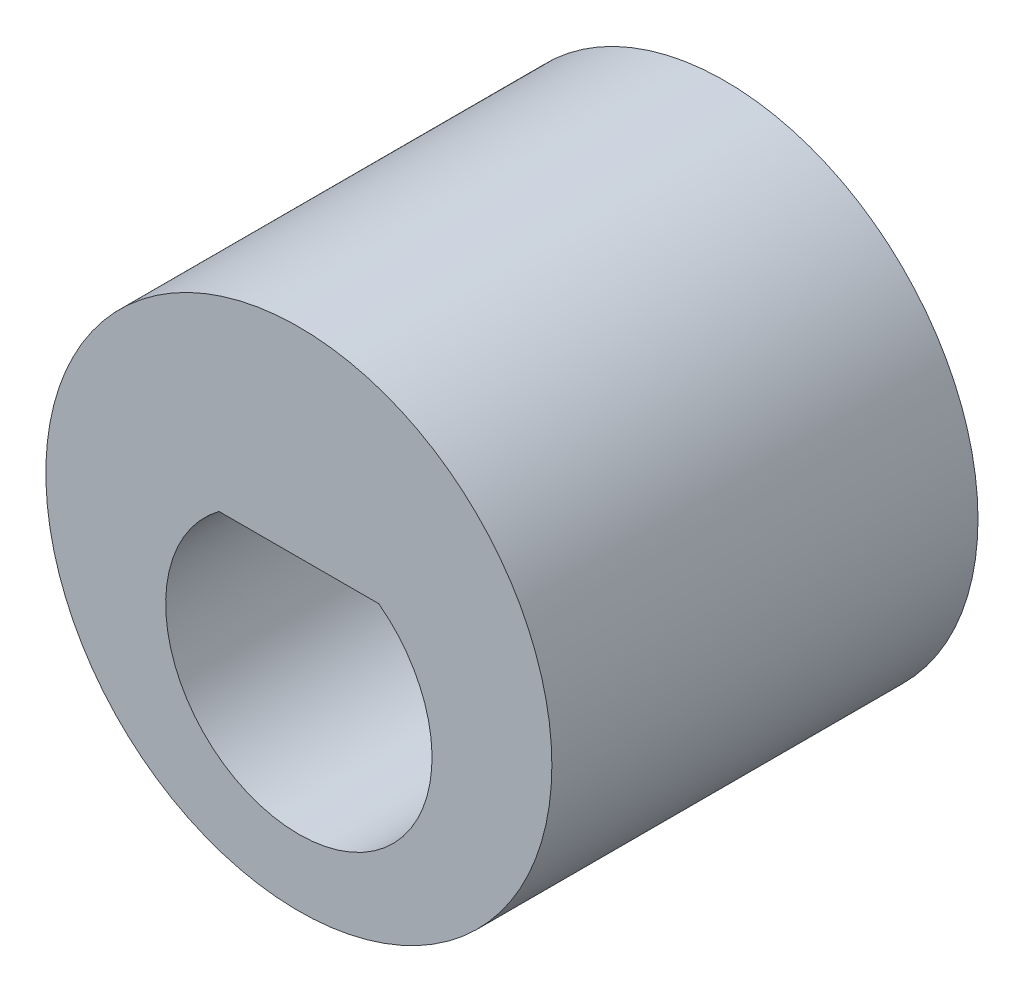
ISO-10303-21;
HEADER;
FILE_DESCRIPTION(('STEP AP214'),'2;1');
FILE_NAME('part.step','',(''),(''),'','','');
FILE_SCHEMA(('AUTOMOTIVE_DESIGN { 1 0 10303 214 1 1 1 1 }'));
ENDSEC;
DATA;
#1=APPLICATION_CONTEXT('core data for automotive mechanical design processes');
#2=APPLICATION_PROTOCOL_DEFINITION('international standard','automotive_design',2000,#1);
#3=PRODUCT_CONTEXT('',#1,'mechanical');
#4=PRODUCT('Part','Part','',(#3));
#5=PRODUCT_RELATED_PRODUCT_CATEGORY('part','',(#4));
#6=PRODUCT_DEFINITION_FORMATION('','',#4);
#7=PRODUCT_DEFINITION_CONTEXT('part definition',#1,'design');
#8=PRODUCT_DEFINITION('design','',#6,#7);
#9=PRODUCT_DEFINITION_SHAPE('','',#8);
#10=(LENGTH_UNIT() NAMED_UNIT(*) SI_UNIT(.MILLI.,.METRE.));
#11=(NAMED_UNIT(*) PLANE_ANGLE_UNIT() SI_UNIT($,.RADIAN.));
#12=(NAMED_UNIT(*) SI_UNIT($,.STERADIAN.) SOLID_ANGLE_UNIT());
#13=UNCERTAINTY_MEASURE_WITH_UNIT(LENGTH_MEASURE(1.E-05),#10,'distance_accuracy_value','');
#14=(GEOMETRIC_REPRESENTATION_CONTEXT(3) GLOBAL_UNCERTAINTY_ASSIGNED_CONTEXT((#13)) GLOBAL_UNIT_ASSIGNED_CONTEXT((#10,
#11,#12)) REPRESENTATION_CONTEXT('',''));
#15=CARTESIAN_POINT('',(0.,0.,0.));
#16=DIRECTION('',(0.,0.,1.));
#17=DIRECTION('',(1.,0.,0.));
#18=AXIS2_PLACEMENT_3D('',#15,#16,#17);
#19=CARTESIAN_POINT('',(0.,0.,8.));
#20=DIRECTION('',(0.,0.,-1.));
#21=DIRECTION('',(-1.,0.,0.));
#22=AXIS2_PLACEMENT_3D('',#19,#20,#21);
#23=CYLINDRICAL_SURFACE('',#22,2.5);
#24=CARTESIAN_POINT('',(0.,0.,0.));
#25=DIRECTION('',(0.,0.,1.));
#26=DIRECTION('',(1.,0.,0.));
#27=AXIS2_PLACEMENT_3D('',#24,#25,#26);
#28=CIRCLE('',#27,2.5);
#29=CARTESIAN_POINT('',(-1.5,2.,0.));
#30=VERTEX_POINT('',#29);
#31=CARTESIAN_POINT('',(1.5,2.,0.));
#32=VERTEX_POINT('',#31);
#33=EDGE_CURVE('E65',#30,#32,#28,.T.);
#34=ORIENTED_EDGE('',*,*,#33,.F.);
#35=DIRECTION('',(0.,0.,-1.));
#36=VECTOR('',#35,1.);
#37=CARTESIAN_POINT('',(-1.5,2.,8.));
#38=LINE('',#37,#36);
#39=CARTESIAN_POINT('',(-1.5,2.,8.));
#40=VERTEX_POINT('',#39);
#41=EDGE_CURVE('E11',#40,#30,#38,.T.);
#42=ORIENTED_EDGE('',*,*,#41,.F.);
#43=CARTESIAN_POINT('',(0.,0.,8.));
#44=DIRECTION('',(0.,0.,1.));
#45=DIRECTION('',(1.,0.,0.));
#46=AXIS2_PLACEMENT_3D('',#43,#44,#45);
#47=CIRCLE('',#46,2.5);
#48=CARTESIAN_POINT('',(1.5,2.,8.));
#49=VERTEX_POINT('',#48);
#50=EDGE_CURVE('E66',#40,#49,#47,.T.);
#51=ORIENTED_EDGE('',*,*,#50,.T.);
#52=DIRECTION('',(0.,0.,-1.));
#53=VECTOR('',#52,1.);
#54=CARTESIAN_POINT('',(1.5,2.,8.));
#55=LINE('',#54,#53);
#56=EDGE_CURVE('E45',#49,#32,#55,.T.);
#57=ORIENTED_EDGE('',*,*,#56,.T.);
#58=EDGE_LOOP('',(#34,#42,#51,#57));
#59=FACE_BOUND('',#58,.T.);
#60=ADVANCED_FACE('F37',(#59),#23,.F.);
#61=CARTESIAN_POINT('',(0.,2.,8.));
#62=DIRECTION('',(0.,1.,0.));
#63=DIRECTION('',(0.,0.,1.));
#64=AXIS2_PLACEMENT_3D('',#61,#62,#63);
#65=PLANE('',#64);
#66=DIRECTION('',(1.,0.,0.));
#67=VECTOR('',#66,1.);
#68=CARTESIAN_POINT('',(0.,2.,0.));
#69=LINE('',#68,#67);
#70=EDGE_CURVE('E68',#30,#32,#69,.T.);
#71=ORIENTED_EDGE('',*,*,#70,.T.);
#72=ORIENTED_EDGE('',*,*,#56,.F.);
#73=DIRECTION('',(1.,0.,0.));
#74=VECTOR('',#73,1.);
#75=CARTESIAN_POINT('',(0.,2.,8.));
#76=LINE('',#75,#74);
#77=EDGE_CURVE('E52',#40,#49,#76,.T.);
#78=ORIENTED_EDGE('',*,*,#77,.F.);
#79=ORIENTED_EDGE('',*,*,#41,.T.);
#80=EDGE_LOOP('',(#71,#72,#78,#79));
#81=FACE_BOUND('',#80,.T.);
#82=ADVANCED_FACE('F69',(#81),#65,.F.);
#83=CARTESIAN_POINT('',(0.,1.,8.));
#84=DIRECTION('',(0.,0.,-1.));
#85=DIRECTION('',(-1.,0.,0.));
#86=AXIS2_PLACEMENT_3D('',#83,#84,#85);
#87=CYLINDRICAL_SURFACE('',#86,4.75);
#88=CARTESIAN_POINT('',(0.,1.,8.));
#89=DIRECTION('',(0.,0.,1.));
#90=DIRECTION('',(1.,0.,0.));
#91=AXIS2_PLACEMENT_3D('',#88,#89,#90);
#92=CIRCLE('',#91,4.75);
#93=CARTESIAN_POINT('',(4.75,1.,8.));
#94=VERTEX_POINT('',#93);
#95=EDGE_CURVE('E67',#94,#94,#92,.T.);
#96=ORIENTED_EDGE('',*,*,#95,.F.);
#97=EDGE_LOOP('',(#96));
#98=FACE_BOUND('',#97,.T.);
#99=CARTESIAN_POINT('',(0.,1.,0.));
#100=DIRECTION('',(0.,0.,1.));
#101=DIRECTION('',(1.,0.,0.));
#102=AXIS2_PLACEMENT_3D('',#99,#100,#101);
#103=CIRCLE('',#102,4.75);
#104=CARTESIAN_POINT('',(4.75,1.,0.));
#105=VERTEX_POINT('',#104);
#106=EDGE_CURVE('E71',#105,#105,#103,.T.);
#107=ORIENTED_EDGE('',*,*,#106,.T.);
#108=EDGE_LOOP('',(#107));
#109=FACE_BOUND('',#108,.T.);
#110=ADVANCED_FACE('F88',(#98,#109),#87,.T.);
#111=CARTESIAN_POINT('',(0.,0.,8.));
#112=DIRECTION('',(0.,0.,1.));
#113=DIRECTION('',(1.,0.,0.));
#114=AXIS2_PLACEMENT_3D('',#111,#112,#113);
#115=PLANE('',#114);
#116=ORIENTED_EDGE('',*,*,#50,.F.);
#117=ORIENTED_EDGE('',*,*,#77,.T.);
#118=EDGE_LOOP('',(#116,#117));
#119=FACE_BOUND('',#118,.T.);
#120=ORIENTED_EDGE('',*,*,#95,.T.);
#121=EDGE_LOOP('',(#120));
#122=FACE_BOUND('',#121,.T.);
#123=ADVANCED_FACE('F86',(#119,#122),#115,.T.);
#124=CARTESIAN_POINT('',(0.,0.,0.));
#125=DIRECTION('',(0.,0.,1.));
#126=DIRECTION('',(1.,0.,0.));
#127=AXIS2_PLACEMENT_3D('',#124,#125,#126);
#128=PLANE('',#127);
#129=ORIENTED_EDGE('',*,*,#33,.T.);
#130=ORIENTED_EDGE('',*,*,#70,.F.);
#131=EDGE_LOOP('',(#129,#130));
#132=FACE_BOUND('',#131,.T.);
#133=ORIENTED_EDGE('',*,*,#106,.F.);
#134=EDGE_LOOP('',(#133));
#135=FACE_BOUND('',#134,.T.);
#136=ADVANCED_FACE('F73',(#132,#135),#128,.F.);
#137=CLOSED_SHELL('',(#60,#82,#110,#123,#136));
#138=MANIFOLD_SOLID_BREP('B2',#137);
#139=ADVANCED_BREP_SHAPE_REPRESENTATION('',(#18,#138),#14);
#140=SHAPE_DEFINITION_REPRESENTATION(#9,#139);
ENDSEC;
END-ISO-10303-21;
